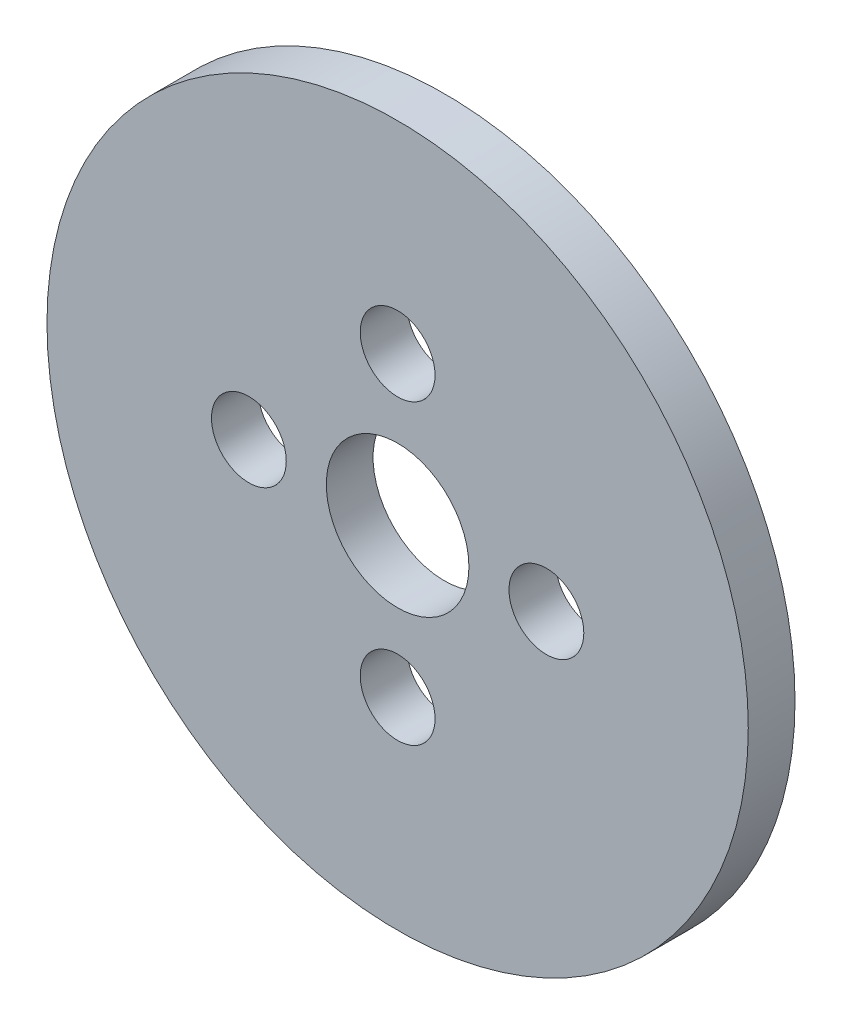
ISO-10303-21;
HEADER;
FILE_DESCRIPTION(('STEP AP214'),'2;1');
FILE_NAME('part.step','',(''),(''),'','','');
FILE_SCHEMA(('AUTOMOTIVE_DESIGN { 1 0 10303 214 1 1 1 1 }'));
ENDSEC;
DATA;
#1=APPLICATION_CONTEXT('core data for automotive mechanical design processes');
#2=APPLICATION_PROTOCOL_DEFINITION('international standard','automotive_design',2000,#1);
#3=PRODUCT_CONTEXT('',#1,'mechanical');
#4=PRODUCT('Part','Part','',(#3));
#5=PRODUCT_RELATED_PRODUCT_CATEGORY('part','',(#4));
#6=PRODUCT_DEFINITION_FORMATION('','',#4);
#7=PRODUCT_DEFINITION_CONTEXT('part definition',#1,'design');
#8=PRODUCT_DEFINITION('design','',#6,#7);
#9=PRODUCT_DEFINITION_SHAPE('','',#8);
#10=(LENGTH_UNIT() NAMED_UNIT(*) SI_UNIT(.MILLI.,.METRE.));
#11=(NAMED_UNIT(*) PLANE_ANGLE_UNIT() SI_UNIT($,.RADIAN.));
#12=(NAMED_UNIT(*) SI_UNIT($,.STERADIAN.) SOLID_ANGLE_UNIT());
#13=UNCERTAINTY_MEASURE_WITH_UNIT(LENGTH_MEASURE(1.E-05),#10,'distance_accuracy_value','');
#14=(GEOMETRIC_REPRESENTATION_CONTEXT(3) GLOBAL_UNCERTAINTY_ASSIGNED_CONTEXT((#13)) GLOBAL_UNIT_ASSIGNED_CONTEXT((#10,
#11,#12)) REPRESENTATION_CONTEXT('',''));
#15=CARTESIAN_POINT('',(0.,0.,0.));
#16=DIRECTION('',(0.,0.,1.));
#17=DIRECTION('',(1.,0.,0.));
#18=AXIS2_PLACEMENT_3D('',#15,#16,#17);
#19=CARTESIAN_POINT('',(0.,0.,2.));
#20=DIRECTION('',(0.,0.,1.));
#21=DIRECTION('',(1.,0.,0.));
#22=AXIS2_PLACEMENT_3D('',#19,#20,#21);
#23=PLANE('',#22);
#24=CARTESIAN_POINT('',(0.,-6.36396103067893,2.));
#25=DIRECTION('',(0.,0.,1.));
#26=DIRECTION('',(1.,0.,0.));
#27=AXIS2_PLACEMENT_3D('',#24,#25,#26);
#28=CIRCLE('',#27,1.6);
#29=CARTESIAN_POINT('',(1.6,-6.36396103067893,2.));
#30=VERTEX_POINT('',#29);
#31=EDGE_CURVE('E59',#30,#30,#28,.T.);
#32=ORIENTED_EDGE('',*,*,#31,.F.);
#33=EDGE_LOOP('',(#32));
#34=FACE_BOUND('',#33,.T.);
#35=CARTESIAN_POINT('',(6.36396103067893,0.,2.));
#36=DIRECTION('',(0.,0.,1.));
#37=DIRECTION('',(1.,0.,0.));
#38=AXIS2_PLACEMENT_3D('',#35,#36,#37);
#39=CIRCLE('',#38,1.6);
#40=CARTESIAN_POINT('',(7.96396103067893,0.,2.));
#41=VERTEX_POINT('',#40);
#42=EDGE_CURVE('E47',#41,#41,#39,.T.);
#43=ORIENTED_EDGE('',*,*,#42,.F.);
#44=EDGE_LOOP('',(#43));
#45=FACE_BOUND('',#44,.T.);
#46=CARTESIAN_POINT('',(0.,0.,2.));
#47=DIRECTION('',(0.,0.,1.));
#48=DIRECTION('',(1.,0.,0.));
#49=AXIS2_PLACEMENT_3D('',#46,#47,#48);
#50=CIRCLE('',#49,15.);
#51=CARTESIAN_POINT('',(15.,0.,2.));
#52=VERTEX_POINT('',#51);
#53=EDGE_CURVE('E10',#52,#52,#50,.T.);
#54=ORIENTED_EDGE('',*,*,#53,.T.);
#55=EDGE_LOOP('',(#54));
#56=FACE_BOUND('',#55,.T.);
#57=CARTESIAN_POINT('',(0.,6.36396103067893,2.));
#58=DIRECTION('',(0.,0.,1.));
#59=DIRECTION('',(1.,0.,0.));
#60=AXIS2_PLACEMENT_3D('',#57,#58,#59);
#61=CIRCLE('',#60,1.6);
#62=CARTESIAN_POINT('',(1.6,6.36396103067893,2.));
#63=VERTEX_POINT('',#62);
#64=EDGE_CURVE('E42',#63,#63,#61,.T.);
#65=ORIENTED_EDGE('',*,*,#64,.F.);
#66=EDGE_LOOP('',(#65));
#67=FACE_BOUND('',#66,.T.);
#68=CARTESIAN_POINT('',(-6.36396103067893,0.,2.));
#69=DIRECTION('',(0.,0.,1.));
#70=DIRECTION('',(1.,0.,0.));
#71=AXIS2_PLACEMENT_3D('',#68,#69,#70);
#72=CIRCLE('',#71,1.6);
#73=CARTESIAN_POINT('',(-4.76396103067893,0.,2.));
#74=VERTEX_POINT('',#73);
#75=EDGE_CURVE('E53',#74,#74,#72,.T.);
#76=ORIENTED_EDGE('',*,*,#75,.F.);
#77=EDGE_LOOP('',(#76));
#78=FACE_BOUND('',#77,.T.);
#79=CARTESIAN_POINT('',(0.,0.,2.));
#80=DIRECTION('',(0.,0.,1.));
#81=DIRECTION('',(1.,0.,0.));
#82=AXIS2_PLACEMENT_3D('',#79,#80,#81);
#83=CIRCLE('',#82,3.05);
#84=CARTESIAN_POINT('',(3.05,0.,2.));
#85=VERTEX_POINT('',#84);
#86=EDGE_CURVE('E65',#85,#85,#83,.T.);
#87=ORIENTED_EDGE('',*,*,#86,.F.);
#88=EDGE_LOOP('',(#87));
#89=FACE_BOUND('',#88,.T.);
#90=ADVANCED_FACE('F31',(#34,#45,#56,#67,#78,#89),#23,.T.);
#91=CARTESIAN_POINT('',(0.,0.,0.));
#92=DIRECTION('',(0.,0.,1.));
#93=DIRECTION('',(1.,0.,0.));
#94=AXIS2_PLACEMENT_3D('',#91,#92,#93);
#95=PLANE('',#94);
#96=CARTESIAN_POINT('',(0.,0.,0.));
#97=DIRECTION('',(0.,0.,1.));
#98=DIRECTION('',(1.,0.,0.));
#99=AXIS2_PLACEMENT_3D('',#96,#97,#98);
#100=CIRCLE('',#99,15.);
#101=CARTESIAN_POINT('',(15.,0.,0.));
#102=VERTEX_POINT('',#101);
#103=EDGE_CURVE('E35',#102,#102,#100,.T.);
#104=ORIENTED_EDGE('',*,*,#103,.F.);
#105=EDGE_LOOP('',(#104));
#106=FACE_BOUND('',#105,.T.);
#107=CARTESIAN_POINT('',(0.,6.36396103067893,0.));
#108=DIRECTION('',(0.,0.,1.));
#109=DIRECTION('',(1.,0.,0.));
#110=AXIS2_PLACEMENT_3D('',#107,#108,#109);
#111=CIRCLE('',#110,1.6);
#112=CARTESIAN_POINT('',(1.6,6.36396103067893,0.));
#113=VERTEX_POINT('',#112);
#114=EDGE_CURVE('E44',#113,#113,#111,.T.);
#115=ORIENTED_EDGE('',*,*,#114,.T.);
#116=EDGE_LOOP('',(#115));
#117=FACE_BOUND('',#116,.T.);
#118=CARTESIAN_POINT('',(6.36396103067893,0.,0.));
#119=DIRECTION('',(0.,0.,1.));
#120=DIRECTION('',(1.,0.,0.));
#121=AXIS2_PLACEMENT_3D('',#118,#119,#120);
#122=CIRCLE('',#121,1.6);
#123=CARTESIAN_POINT('',(7.96396103067893,0.,0.));
#124=VERTEX_POINT('',#123);
#125=EDGE_CURVE('E50',#124,#124,#122,.T.);
#126=ORIENTED_EDGE('',*,*,#125,.T.);
#127=EDGE_LOOP('',(#126));
#128=FACE_BOUND('',#127,.T.);
#129=CARTESIAN_POINT('',(-6.36396103067893,0.,0.));
#130=DIRECTION('',(0.,0.,1.));
#131=DIRECTION('',(1.,0.,0.));
#132=AXIS2_PLACEMENT_3D('',#129,#130,#131);
#133=CIRCLE('',#132,1.6);
#134=CARTESIAN_POINT('',(-4.76396103067893,0.,0.));
#135=VERTEX_POINT('',#134);
#136=EDGE_CURVE('E56',#135,#135,#133,.T.);
#137=ORIENTED_EDGE('',*,*,#136,.T.);
#138=EDGE_LOOP('',(#137));
#139=FACE_BOUND('',#138,.T.);
#140=CARTESIAN_POINT('',(0.,-6.36396103067893,0.));
#141=DIRECTION('',(0.,0.,1.));
#142=DIRECTION('',(1.,0.,0.));
#143=AXIS2_PLACEMENT_3D('',#140,#141,#142);
#144=CIRCLE('',#143,1.6);
#145=CARTESIAN_POINT('',(1.6,-6.36396103067893,0.));
#146=VERTEX_POINT('',#145);
#147=EDGE_CURVE('E62',#146,#146,#144,.T.);
#148=ORIENTED_EDGE('',*,*,#147,.T.);
#149=EDGE_LOOP('',(#148));
#150=FACE_BOUND('',#149,.T.);
#151=CARTESIAN_POINT('',(0.,0.,0.));
#152=DIRECTION('',(0.,0.,1.));
#153=DIRECTION('',(1.,0.,0.));
#154=AXIS2_PLACEMENT_3D('',#151,#152,#153);
#155=CIRCLE('',#154,3.05);
#156=CARTESIAN_POINT('',(3.05,0.,0.));
#157=VERTEX_POINT('',#156);
#158=EDGE_CURVE('E68',#157,#157,#155,.T.);
#159=ORIENTED_EDGE('',*,*,#158,.T.);
#160=EDGE_LOOP('',(#159));
#161=FACE_BOUND('',#160,.T.);
#162=ADVANCED_FACE('F78',(#106,#117,#128,#139,#150,#161),#95,.F.);
#163=CARTESIAN_POINT('',(0.,0.,2.));
#164=DIRECTION('',(0.,0.,-1.));
#165=DIRECTION('',(-1.,0.,0.));
#166=AXIS2_PLACEMENT_3D('',#163,#164,#165);
#167=CYLINDRICAL_SURFACE('',#166,15.);
#168=ORIENTED_EDGE('',*,*,#53,.F.);
#169=EDGE_LOOP('',(#168));
#170=FACE_BOUND('',#169,.T.);
#171=ORIENTED_EDGE('',*,*,#103,.T.);
#172=EDGE_LOOP('',(#171));
#173=FACE_BOUND('',#172,.T.);
#174=ADVANCED_FACE('F33',(#170,#173),#167,.T.);
#175=CARTESIAN_POINT('',(0.,6.36396103067893,2.));
#176=DIRECTION('',(0.,0.,-1.));
#177=DIRECTION('',(-1.,0.,0.));
#178=AXIS2_PLACEMENT_3D('',#175,#176,#177);
#179=CYLINDRICAL_SURFACE('',#178,1.6);
#180=ORIENTED_EDGE('',*,*,#64,.T.);
#181=EDGE_LOOP('',(#180));
#182=FACE_BOUND('',#181,.T.);
#183=ORIENTED_EDGE('',*,*,#114,.F.);
#184=EDGE_LOOP('',(#183));
#185=FACE_BOUND('',#184,.T.);
#186=ADVANCED_FACE('F88',(#182,#185),#179,.F.);
#187=CARTESIAN_POINT('',(6.36396103067893,0.,2.));
#188=DIRECTION('',(0.,0.,-1.));
#189=DIRECTION('',(-1.,0.,0.));
#190=AXIS2_PLACEMENT_3D('',#187,#188,#189);
#191=CYLINDRICAL_SURFACE('',#190,1.6);
#192=ORIENTED_EDGE('',*,*,#42,.T.);
#193=EDGE_LOOP('',(#192));
#194=FACE_BOUND('',#193,.T.);
#195=ORIENTED_EDGE('',*,*,#125,.F.);
#196=EDGE_LOOP('',(#195));
#197=FACE_BOUND('',#196,.T.);
#198=ADVANCED_FACE('F91',(#194,#197),#191,.F.);
#199=CARTESIAN_POINT('',(-6.36396103067893,0.,2.));
#200=DIRECTION('',(0.,0.,-1.));
#201=DIRECTION('',(-1.,0.,0.));
#202=AXIS2_PLACEMENT_3D('',#199,#200,#201);
#203=CYLINDRICAL_SURFACE('',#202,1.6);
#204=ORIENTED_EDGE('',*,*,#75,.T.);
#205=EDGE_LOOP('',(#204));
#206=FACE_BOUND('',#205,.T.);
#207=ORIENTED_EDGE('',*,*,#136,.F.);
#208=EDGE_LOOP('',(#207));
#209=FACE_BOUND('',#208,.T.);
#210=ADVANCED_FACE('F95',(#206,#209),#203,.F.);
#211=CARTESIAN_POINT('',(0.,-6.36396103067893,2.));
#212=DIRECTION('',(0.,0.,-1.));
#213=DIRECTION('',(-1.,0.,0.));
#214=AXIS2_PLACEMENT_3D('',#211,#212,#213);
#215=CYLINDRICAL_SURFACE('',#214,1.6);
#216=ORIENTED_EDGE('',*,*,#31,.T.);
#217=EDGE_LOOP('',(#216));
#218=FACE_BOUND('',#217,.T.);
#219=ORIENTED_EDGE('',*,*,#147,.F.);
#220=EDGE_LOOP('',(#219));
#221=FACE_BOUND('',#220,.T.);
#222=ADVANCED_FACE('F99',(#218,#221),#215,.F.);
#223=CARTESIAN_POINT('',(0.,0.,2.));
#224=DIRECTION('',(0.,0.,-1.));
#225=DIRECTION('',(-1.,0.,0.));
#226=AXIS2_PLACEMENT_3D('',#223,#224,#225);
#227=CYLINDRICAL_SURFACE('',#226,3.05);
#228=ORIENTED_EDGE('',*,*,#86,.T.);
#229=EDGE_LOOP('',(#228));
#230=FACE_BOUND('',#229,.T.);
#231=ORIENTED_EDGE('',*,*,#158,.F.);
#232=EDGE_LOOP('',(#231));
#233=FACE_BOUND('',#232,.T.);
#234=ADVANCED_FACE('F74',(#230,#233),#227,.F.);
#235=CLOSED_SHELL('',(#90,#162,#174,#186,#198,#210,#222,#234));
#236=MANIFOLD_SOLID_BREP('B2',#235);
#237=ADVANCED_BREP_SHAPE_REPRESENTATION('',(#18,#236),#14);
#238=SHAPE_DEFINITION_REPRESENTATION(#9,#237);
ENDSEC;
END-ISO-10303-21;
